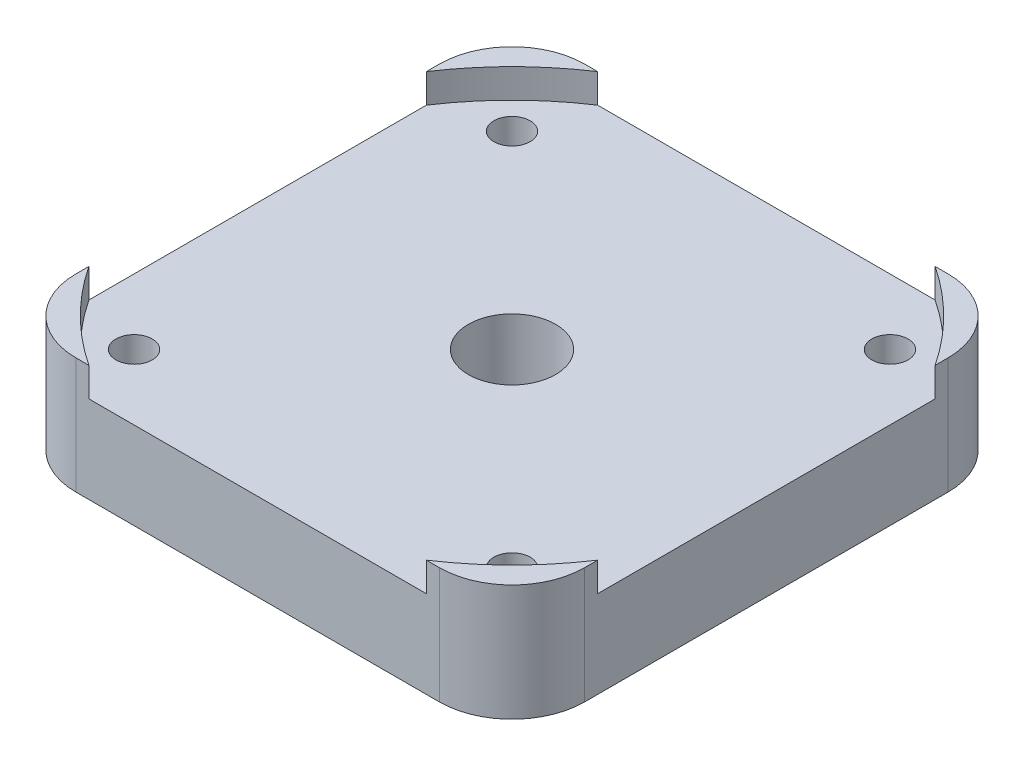
ISO-10303-21;
HEADER;
FILE_DESCRIPTION(('STEP AP214'),'2;1');
FILE_NAME('part.step','',(''),(''),'','','');
FILE_SCHEMA(('AUTOMOTIVE_DESIGN { 1 0 10303 214 1 1 1 1 }'));
ENDSEC;
DATA;
#1=APPLICATION_CONTEXT('core data for automotive mechanical design processes');
#2=APPLICATION_PROTOCOL_DEFINITION('international standard','automotive_design',2000,#1);
#3=PRODUCT_CONTEXT('',#1,'mechanical');
#4=PRODUCT('Part','Part','',(#3));
#5=PRODUCT_RELATED_PRODUCT_CATEGORY('part','',(#4));
#6=PRODUCT_DEFINITION_FORMATION('','',#4);
#7=PRODUCT_DEFINITION_CONTEXT('part definition',#1,'design');
#8=PRODUCT_DEFINITION('design','',#6,#7);
#9=PRODUCT_DEFINITION_SHAPE('','',#8);
#10=(LENGTH_UNIT() NAMED_UNIT(*) SI_UNIT(.MILLI.,.METRE.));
#11=(NAMED_UNIT(*) PLANE_ANGLE_UNIT() SI_UNIT($,.RADIAN.));
#12=(NAMED_UNIT(*) SI_UNIT($,.STERADIAN.) SOLID_ANGLE_UNIT());
#13=UNCERTAINTY_MEASURE_WITH_UNIT(LENGTH_MEASURE(1.E-05),#10,'distance_accuracy_value','');
#14=(GEOMETRIC_REPRESENTATION_CONTEXT(3) GLOBAL_UNCERTAINTY_ASSIGNED_CONTEXT((#13)) GLOBAL_UNIT_ASSIGNED_CONTEXT((#10,
#11,#12)) REPRESENTATION_CONTEXT('',''));
#15=CARTESIAN_POINT('',(0.,0.,0.));
#16=DIRECTION('',(0.,0.,1.));
#17=DIRECTION('',(1.,0.,0.));
#18=AXIS2_PLACEMENT_3D('',#15,#16,#17);
#19=CARTESIAN_POINT('',(0.,0.,0.));
#20=DIRECTION('',(0.,1.,0.));
#21=DIRECTION('',(1.,0.,0.));
#22=AXIS2_PLACEMENT_3D('',#19,#20,#21);
#23=PLANE('',#22);
#24=DIRECTION('',(-1.,0.,0.));
#25=VECTOR('',#24,1.);
#26=CARTESIAN_POINT('',(12.5,0.,-17.5));
#27=LINE('',#26,#25);
#28=CARTESIAN_POINT('',(12.5,0.,-17.5));
#29=VERTEX_POINT('',#28);
#30=CARTESIAN_POINT('',(-12.5,0.,-17.5));
#31=VERTEX_POINT('',#30);
#32=EDGE_CURVE('E35',#29,#31,#27,.T.);
#33=ORIENTED_EDGE('',*,*,#32,.F.);
#34=CARTESIAN_POINT('',(12.5,0.,-12.5));
#35=DIRECTION('',(0.,-1.,0.));
#36=DIRECTION('',(0.,0.,-1.));
#37=AXIS2_PLACEMENT_3D('',#34,#35,#36);
#38=CIRCLE('',#37,5.);
#39=CARTESIAN_POINT('',(17.5,0.,-12.5));
#40=VERTEX_POINT('',#39);
#41=EDGE_CURVE('E11',#29,#40,#38,.T.);
#42=ORIENTED_EDGE('',*,*,#41,.T.);
#43=DIRECTION('',(0.,0.,-1.));
#44=VECTOR('',#43,1.);
#45=CARTESIAN_POINT('',(17.5,0.,12.5));
#46=LINE('',#45,#44);
#47=CARTESIAN_POINT('',(17.5,0.,12.5));
#48=VERTEX_POINT('',#47);
#49=EDGE_CURVE('E271',#48,#40,#46,.T.);
#50=ORIENTED_EDGE('',*,*,#49,.F.);
#51=CARTESIAN_POINT('',(12.5,0.,12.5));
#52=DIRECTION('',(0.,-1.,0.));
#53=DIRECTION('',(1.,0.,0.));
#54=AXIS2_PLACEMENT_3D('',#51,#52,#53);
#55=CIRCLE('',#54,5.);
#56=CARTESIAN_POINT('',(12.5,0.,17.5));
#57=VERTEX_POINT('',#56);
#58=EDGE_CURVE('E27',#48,#57,#55,.T.);
#59=ORIENTED_EDGE('',*,*,#58,.T.);
#60=DIRECTION('',(1.,0.,0.));
#61=VECTOR('',#60,1.);
#62=CARTESIAN_POINT('',(-12.5,0.,17.5));
#63=LINE('',#62,#61);
#64=CARTESIAN_POINT('',(-12.5,0.,17.5));
#65=VERTEX_POINT('',#64);
#66=EDGE_CURVE('E150',#65,#57,#63,.T.);
#67=ORIENTED_EDGE('',*,*,#66,.F.);
#68=CARTESIAN_POINT('',(-12.5,0.,12.5));
#69=DIRECTION('',(0.,-1.,0.));
#70=DIRECTION('',(0.,0.,1.));
#71=AXIS2_PLACEMENT_3D('',#68,#69,#70);
#72=CIRCLE('',#71,5.);
#73=CARTESIAN_POINT('',(-17.5,0.,12.5));
#74=VERTEX_POINT('',#73);
#75=EDGE_CURVE('E148',#65,#74,#72,.T.);
#76=ORIENTED_EDGE('',*,*,#75,.T.);
#77=DIRECTION('',(0.,0.,1.));
#78=VECTOR('',#77,1.);
#79=CARTESIAN_POINT('',(-17.5,0.,-12.5));
#80=LINE('',#79,#78);
#81=CARTESIAN_POINT('',(-17.5,0.,-12.5));
#82=VERTEX_POINT('',#81);
#83=EDGE_CURVE('E219',#82,#74,#80,.T.);
#84=ORIENTED_EDGE('',*,*,#83,.F.);
#85=CARTESIAN_POINT('',(-12.5,0.,-12.5));
#86=DIRECTION('',(0.,-1.,0.));
#87=DIRECTION('',(-1.,0.,0.));
#88=AXIS2_PLACEMENT_3D('',#85,#86,#87);
#89=CIRCLE('',#88,5.);
#90=EDGE_CURVE('E283',#82,#31,#89,.T.);
#91=ORIENTED_EDGE('',*,*,#90,.T.);
#92=EDGE_LOOP('',(#33,#42,#50,#59,#67,#76,#84,#91));
#93=FACE_BOUND('',#92,.T.);
#94=CARTESIAN_POINT('',(0.,0.,0.));
#95=DIRECTION('',(0.,-1.,0.));
#96=DIRECTION('',(1.,0.,0.));
#97=AXIS2_PLACEMENT_3D('',#94,#95,#96);
#98=CIRCLE('',#97,11.);
#99=CARTESIAN_POINT('',(11.,0.,0.));
#100=VERTEX_POINT('',#99);
#101=EDGE_CURVE('E287',#100,#100,#98,.T.);
#102=ORIENTED_EDGE('',*,*,#101,.F.);
#103=EDGE_LOOP('',(#102));
#104=FACE_BOUND('',#103,.T.);
#105=CARTESIAN_POINT('',(-13.,0.,-13.));
#106=DIRECTION('',(0.,1.,0.));
#107=DIRECTION('',(1.,0.,0.));
#108=AXIS2_PLACEMENT_3D('',#105,#106,#107);
#109=CIRCLE('',#108,1.25);
#110=CARTESIAN_POINT('',(-11.75,0.,-13.));
#111=VERTEX_POINT('',#110);
#112=EDGE_CURVE('E286',#111,#111,#109,.T.);
#113=ORIENTED_EDGE('',*,*,#112,.T.);
#114=EDGE_LOOP('',(#113));
#115=FACE_BOUND('',#114,.T.);
#116=CARTESIAN_POINT('',(-13.,0.,13.));
#117=DIRECTION('',(0.,1.,0.));
#118=DIRECTION('',(0.,0.,-1.));
#119=AXIS2_PLACEMENT_3D('',#116,#117,#118);
#120=CIRCLE('',#119,1.25);
#121=CARTESIAN_POINT('',(-13.,0.,11.75));
#122=VERTEX_POINT('',#121);
#123=EDGE_CURVE('E294',#122,#122,#120,.T.);
#124=ORIENTED_EDGE('',*,*,#123,.T.);
#125=EDGE_LOOP('',(#124));
#126=FACE_BOUND('',#125,.T.);
#127=CARTESIAN_POINT('',(13.,0.,13.));
#128=DIRECTION('',(0.,1.,0.));
#129=DIRECTION('',(-1.,0.,0.));
#130=AXIS2_PLACEMENT_3D('',#127,#128,#129);
#131=CIRCLE('',#130,1.25);
#132=CARTESIAN_POINT('',(11.75,0.,13.));
#133=VERTEX_POINT('',#132);
#134=EDGE_CURVE('E297',#133,#133,#131,.T.);
#135=ORIENTED_EDGE('',*,*,#134,.T.);
#136=EDGE_LOOP('',(#135));
#137=FACE_BOUND('',#136,.T.);
#138=CARTESIAN_POINT('',(13.,0.,-13.));
#139=DIRECTION('',(0.,1.,0.));
#140=DIRECTION('',(0.,0.,1.));
#141=AXIS2_PLACEMENT_3D('',#138,#139,#140);
#142=CIRCLE('',#141,1.25);
#143=CARTESIAN_POINT('',(13.,0.,-11.75));
#144=VERTEX_POINT('',#143);
#145=EDGE_CURVE('E290',#144,#144,#142,.T.);
#146=ORIENTED_EDGE('',*,*,#145,.T.);
#147=EDGE_LOOP('',(#146));
#148=FACE_BOUND('',#147,.T.);
#149=ADVANCED_FACE('F17',(#93,#104,#115,#126,#137,#148),#23,.F.);
#150=CARTESIAN_POINT('',(0.,0.,0.));
#151=DIRECTION('',(0.,-1.,0.));
#152=DIRECTION('',(-1.,0.,0.));
#153=AXIS2_PLACEMENT_3D('',#150,#151,#152);
#154=CYLINDRICAL_SURFACE('',#153,11.);
#155=CARTESIAN_POINT('',(0.,-2.5,0.));
#156=DIRECTION('',(0.,-1.,0.));
#157=DIRECTION('',(-1.,0.,0.));
#158=AXIS2_PLACEMENT_3D('',#155,#156,#157);
#159=CIRCLE('',#158,11.);
#160=CARTESIAN_POINT('',(-11.,-2.5,0.));
#161=VERTEX_POINT('',#160);
#162=EDGE_CURVE('E291',#161,#161,#159,.T.);
#163=ORIENTED_EDGE('',*,*,#162,.F.);
#164=EDGE_LOOP('',(#163));
#165=FACE_BOUND('',#164,.T.);
#166=ORIENTED_EDGE('',*,*,#101,.T.);
#167=EDGE_LOOP('',(#166));
#168=FACE_BOUND('',#167,.T.);
#169=ADVANCED_FACE('F333',(#165,#168),#154,.T.);
#170=CARTESIAN_POINT('',(0.,-2.5,0.));
#171=DIRECTION('',(0.,-1.,0.));
#172=DIRECTION('',(-1.,0.,0.));
#173=AXIS2_PLACEMENT_3D('',#170,#171,#172);
#174=PLANE('',#173);
#175=ORIENTED_EDGE('',*,*,#162,.T.);
#176=EDGE_LOOP('',(#175));
#177=FACE_BOUND('',#176,.T.);
#178=CARTESIAN_POINT('',(0.,-2.5,0.));
#179=DIRECTION('',(0.,1.,0.));
#180=DIRECTION('',(1.,0.,0.));
#181=AXIS2_PLACEMENT_3D('',#178,#179,#180);
#182=CIRCLE('',#181,3.);
#183=CARTESIAN_POINT('',(3.,-2.5,0.));
#184=VERTEX_POINT('',#183);
#185=EDGE_CURVE('E303',#184,#184,#182,.T.);
#186=ORIENTED_EDGE('',*,*,#185,.T.);
#187=EDGE_LOOP('',(#186));
#188=FACE_BOUND('',#187,.T.);
#189=ADVANCED_FACE('F339',(#177,#188),#174,.T.);
#190=CARTESIAN_POINT('',(0.,-2.5,0.));
#191=DIRECTION('',(0.,1.,0.));
#192=DIRECTION('',(-1.,0.,0.));
#193=AXIS2_PLACEMENT_3D('',#190,#191,#192);
#194=CYLINDRICAL_SURFACE('',#193,3.);
#195=CARTESIAN_POINT('',(0.,6.,0.));
#196=DIRECTION('',(0.,1.,0.));
#197=DIRECTION('',(-1.,0.,0.));
#198=AXIS2_PLACEMENT_3D('',#195,#196,#197);
#199=CIRCLE('',#198,3.);
#200=CARTESIAN_POINT('',(-3.,6.,0.));
#201=VERTEX_POINT('',#200);
#202=EDGE_CURVE('E203',#201,#201,#199,.T.);
#203=ORIENTED_EDGE('',*,*,#202,.T.);
#204=EDGE_LOOP('',(#203));
#205=FACE_BOUND('',#204,.T.);
#206=ORIENTED_EDGE('',*,*,#185,.F.);
#207=EDGE_LOOP('',(#206));
#208=FACE_BOUND('',#207,.T.);
#209=ADVANCED_FACE('F310',(#205,#208),#194,.F.);
#210=CARTESIAN_POINT('',(0.,6.,0.));
#211=DIRECTION('',(0.,-1.,0.));
#212=DIRECTION('',(1.,0.,0.));
#213=AXIS2_PLACEMENT_3D('',#210,#211,#212);
#214=PLANE('',#213);
#215=CARTESIAN_POINT('',(0.,6.,0.));
#216=DIRECTION('',(0.,-1.,0.));
#217=DIRECTION('',(-0.552770798392605,0.,0.833333333333308));
#218=AXIS2_PLACEMENT_3D('',#215,#216,#217);
#219=CIRCLE('',#218,21.);
#220=CARTESIAN_POINT('',(-11.60818676624,6.,17.5));
#221=VERTEX_POINT('',#220);
#222=CARTESIAN_POINT('',(-17.5,6.,11.60818676624));
#223=VERTEX_POINT('',#222);
#224=EDGE_CURVE('E190',#221,#223,#219,.T.);
#225=ORIENTED_EDGE('',*,*,#224,.F.);
#226=DIRECTION('',(1.,0.,0.));
#227=VECTOR('',#226,1.);
#228=CARTESIAN_POINT('',(-11.60818676624,6.,17.5));
#229=LINE('',#228,#227);
#230=CARTESIAN_POINT('',(11.60818676624,6.,17.5));
#231=VERTEX_POINT('',#230);
#232=EDGE_CURVE('E205',#221,#231,#229,.T.);
#233=ORIENTED_EDGE('',*,*,#232,.T.);
#234=CARTESIAN_POINT('',(0.,6.,0.));
#235=DIRECTION('',(0.,-1.,0.));
#236=DIRECTION('',(0.833333333333308,0.,0.552770798392605));
#237=AXIS2_PLACEMENT_3D('',#234,#235,#236);
#238=CIRCLE('',#237,21.);
#239=CARTESIAN_POINT('',(17.5,6.,11.60818676624));
#240=VERTEX_POINT('',#239);
#241=EDGE_CURVE('E189',#240,#231,#238,.T.);
#242=ORIENTED_EDGE('',*,*,#241,.F.);
#243=DIRECTION('',(0.,0.,-1.));
#244=VECTOR('',#243,1.);
#245=CARTESIAN_POINT('',(17.5,6.,11.60818676624));
#246=LINE('',#245,#244);
#247=CARTESIAN_POINT('',(17.5,6.,-11.60818676624));
#248=VERTEX_POINT('',#247);
#249=EDGE_CURVE('E207',#240,#248,#246,.T.);
#250=ORIENTED_EDGE('',*,*,#249,.T.);
#251=CARTESIAN_POINT('',(0.,6.,0.));
#252=DIRECTION('',(0.,-1.,0.));
#253=DIRECTION('',(0.552770798392605,0.,-0.833333333333308));
#254=AXIS2_PLACEMENT_3D('',#251,#252,#253);
#255=CIRCLE('',#254,21.);
#256=CARTESIAN_POINT('',(11.60818676624,6.,-17.5));
#257=VERTEX_POINT('',#256);
#258=EDGE_CURVE('E212',#257,#248,#255,.T.);
#259=ORIENTED_EDGE('',*,*,#258,.F.);
#260=DIRECTION('',(-1.,0.,0.));
#261=VECTOR('',#260,1.);
#262=CARTESIAN_POINT('',(11.60818676624,6.,-17.5));
#263=LINE('',#262,#261);
#264=CARTESIAN_POINT('',(-11.60818676624,6.,-17.5));
#265=VERTEX_POINT('',#264);
#266=EDGE_CURVE('E211',#257,#265,#263,.T.);
#267=ORIENTED_EDGE('',*,*,#266,.T.);
#268=CARTESIAN_POINT('',(0.,6.,0.));
#269=DIRECTION('',(0.,-1.,0.));
#270=DIRECTION('',(-0.833333333333308,0.,-0.552770798392605));
#271=AXIS2_PLACEMENT_3D('',#268,#269,#270);
#272=CIRCLE('',#271,21.);
#273=CARTESIAN_POINT('',(-17.5,6.,-11.60818676624));
#274=VERTEX_POINT('',#273);
#275=EDGE_CURVE('E159',#274,#265,#272,.T.);
#276=ORIENTED_EDGE('',*,*,#275,.F.);
#277=DIRECTION('',(0.,0.,1.));
#278=VECTOR('',#277,1.);
#279=CARTESIAN_POINT('',(-17.5,6.,-11.60818676624));
#280=LINE('',#279,#278);
#281=EDGE_CURVE('E217',#274,#223,#280,.T.);
#282=ORIENTED_EDGE('',*,*,#281,.T.);
#283=EDGE_LOOP('',(#225,#233,#242,#250,#259,#267,#276,#282));
#284=FACE_BOUND('',#283,.T.);
#285=ORIENTED_EDGE('',*,*,#202,.F.);
#286=EDGE_LOOP('',(#285));
#287=FACE_BOUND('',#286,.T.);
#288=CARTESIAN_POINT('',(-13.,6.,-13.));
#289=DIRECTION('',(0.,1.,0.));
#290=DIRECTION('',(1.,0.,0.));
#291=AXIS2_PLACEMENT_3D('',#288,#289,#290);
#292=CIRCLE('',#291,1.25);
#293=CARTESIAN_POINT('',(-11.75,6.,-13.));
#294=VERTEX_POINT('',#293);
#295=EDGE_CURVE('E194',#294,#294,#292,.T.);
#296=ORIENTED_EDGE('',*,*,#295,.F.);
#297=EDGE_LOOP('',(#296));
#298=FACE_BOUND('',#297,.T.);
#299=CARTESIAN_POINT('',(-13.,6.,13.));
#300=DIRECTION('',(0.,1.,0.));
#301=DIRECTION('',(0.,0.,-1.));
#302=AXIS2_PLACEMENT_3D('',#299,#300,#301);
#303=CIRCLE('',#302,1.25);
#304=CARTESIAN_POINT('',(-13.,6.,11.75));
#305=VERTEX_POINT('',#304);
#306=EDGE_CURVE('E199',#305,#305,#303,.T.);
#307=ORIENTED_EDGE('',*,*,#306,.F.);
#308=EDGE_LOOP('',(#307));
#309=FACE_BOUND('',#308,.T.);
#310=CARTESIAN_POINT('',(13.,6.,13.));
#311=DIRECTION('',(0.,1.,0.));
#312=DIRECTION('',(-1.,0.,0.));
#313=AXIS2_PLACEMENT_3D('',#310,#311,#312);
#314=CIRCLE('',#313,1.25);
#315=CARTESIAN_POINT('',(11.75,6.,13.));
#316=VERTEX_POINT('',#315);
#317=EDGE_CURVE('E223',#316,#316,#314,.T.);
#318=ORIENTED_EDGE('',*,*,#317,.F.);
#319=EDGE_LOOP('',(#318));
#320=FACE_BOUND('',#319,.T.);
#321=CARTESIAN_POINT('',(13.,6.,-13.));
#322=DIRECTION('',(0.,1.,0.));
#323=DIRECTION('',(0.,0.,1.));
#324=AXIS2_PLACEMENT_3D('',#321,#322,#323);
#325=CIRCLE('',#324,1.25);
#326=CARTESIAN_POINT('',(13.,6.,-11.75));
#327=VERTEX_POINT('',#326);
#328=EDGE_CURVE('E226',#327,#327,#325,.T.);
#329=ORIENTED_EDGE('',*,*,#328,.F.);
#330=EDGE_LOOP('',(#329));
#331=FACE_BOUND('',#330,.T.);
#332=ADVANCED_FACE('F313',(#284,#287,#298,#309,#320,#331),#214,.F.);
#333=CARTESIAN_POINT('',(-17.5,0.,-17.5));
#334=DIRECTION('',(-1.,0.,0.));
#335=DIRECTION('',(0.,0.,1.));
#336=AXIS2_PLACEMENT_3D('',#333,#334,#335);
#337=PLANE('',#336);
#338=ORIENTED_EDGE('',*,*,#83,.T.);
#339=DIRECTION('',(0.,-1.,0.));
#340=VECTOR('',#339,1.);
#341=CARTESIAN_POINT('',(-17.5,8.,12.5));
#342=LINE('',#341,#340);
#343=CARTESIAN_POINT('',(-17.5,8.,12.5));
#344=VERTEX_POINT('',#343);
#345=EDGE_CURVE('E229',#344,#74,#342,.T.);
#346=ORIENTED_EDGE('',*,*,#345,.F.);
#347=DIRECTION('',(0.,0.,1.));
#348=VECTOR('',#347,1.);
#349=CARTESIAN_POINT('',(-17.5,8.,11.60818676624));
#350=LINE('',#349,#348);
#351=CARTESIAN_POINT('',(-17.5,8.,11.60818676624));
#352=VERTEX_POINT('',#351);
#353=EDGE_CURVE('E153',#352,#344,#350,.T.);
#354=ORIENTED_EDGE('',*,*,#353,.F.);
#355=DIRECTION('',(0.,-1.,0.));
#356=VECTOR('',#355,1.);
#357=CARTESIAN_POINT('',(-17.5,8.,11.60818676624));
#358=LINE('',#357,#356);
#359=EDGE_CURVE('E231',#352,#223,#358,.T.);
#360=ORIENTED_EDGE('',*,*,#359,.T.);
#361=ORIENTED_EDGE('',*,*,#281,.F.);
#362=DIRECTION('',(0.,-1.,0.));
#363=VECTOR('',#362,1.);
#364=CARTESIAN_POINT('',(-17.5,8.,-11.60818676624));
#365=LINE('',#364,#363);
#366=CARTESIAN_POINT('',(-17.5,8.,-11.60818676624));
#367=VERTEX_POINT('',#366);
#368=EDGE_CURVE('E155',#367,#274,#365,.T.);
#369=ORIENTED_EDGE('',*,*,#368,.F.);
#370=DIRECTION('',(0.,0.,1.));
#371=VECTOR('',#370,1.);
#372=CARTESIAN_POINT('',(-17.5,8.,-12.5));
#373=LINE('',#372,#371);
#374=CARTESIAN_POINT('',(-17.5,8.,-12.5));
#375=VERTEX_POINT('',#374);
#376=EDGE_CURVE('E165',#375,#367,#373,.T.);
#377=ORIENTED_EDGE('',*,*,#376,.F.);
#378=DIRECTION('',(0.,-1.,0.));
#379=VECTOR('',#378,1.);
#380=CARTESIAN_POINT('',(-17.5,8.,-12.5));
#381=LINE('',#380,#379);
#382=EDGE_CURVE('E233',#375,#82,#381,.T.);
#383=ORIENTED_EDGE('',*,*,#382,.T.);
#384=EDGE_LOOP('',(#338,#346,#354,#360,#361,#369,#377,#383));
#385=FACE_BOUND('',#384,.T.);
#386=ADVANCED_FACE('F316',(#385),#337,.T.);
#387=CARTESIAN_POINT('',(-12.5,21.6878,-12.5));
#388=DIRECTION('',(0.,-1.,0.));
#389=DIRECTION('',(-1.,0.,0.));
#390=AXIS2_PLACEMENT_3D('',#387,#388,#389);
#391=CYLINDRICAL_SURFACE('',#390,5.);
#392=ORIENTED_EDGE('',*,*,#382,.F.);
#393=CARTESIAN_POINT('',(-12.5,8.,-12.5));
#394=DIRECTION('',(0.,1.,0.));
#395=DIRECTION('',(0.,0.,-1.));
#396=AXIS2_PLACEMENT_3D('',#393,#394,#395);
#397=CIRCLE('',#396,5.);
#398=CARTESIAN_POINT('',(-12.5,8.,-17.5));
#399=VERTEX_POINT('',#398);
#400=EDGE_CURVE('E240',#399,#375,#397,.T.);
#401=ORIENTED_EDGE('',*,*,#400,.F.);
#402=DIRECTION('',(0.,-1.,0.));
#403=VECTOR('',#402,1.);
#404=CARTESIAN_POINT('',(-12.5,8.,-17.5));
#405=LINE('',#404,#403);
#406=EDGE_CURVE('E239',#399,#31,#405,.T.);
#407=ORIENTED_EDGE('',*,*,#406,.T.);
#408=ORIENTED_EDGE('',*,*,#90,.F.);
#409=EDGE_LOOP('',(#392,#401,#407,#408));
#410=FACE_BOUND('',#409,.T.);
#411=ADVANCED_FACE('F351',(#410),#391,.T.);
#412=CARTESIAN_POINT('',(17.5,0.,-17.5));
#413=DIRECTION('',(0.,0.,-1.));
#414=DIRECTION('',(-1.,0.,0.));
#415=AXIS2_PLACEMENT_3D('',#412,#413,#414);
#416=PLANE('',#415);
#417=DIRECTION('',(-1.,0.,0.));
#418=VECTOR('',#417,1.);
#419=CARTESIAN_POINT('',(-11.60818676624,8.,-17.5));
#420=LINE('',#419,#418);
#421=CARTESIAN_POINT('',(-11.60818676624,8.,-17.5));
#422=VERTEX_POINT('',#421);
#423=EDGE_CURVE('E166',#422,#399,#420,.T.);
#424=ORIENTED_EDGE('',*,*,#423,.F.);
#425=DIRECTION('',(0.,-1.,0.));
#426=VECTOR('',#425,1.);
#427=CARTESIAN_POINT('',(-11.60818676624,8.,-17.5));
#428=LINE('',#427,#426);
#429=EDGE_CURVE('E245',#422,#265,#428,.T.);
#430=ORIENTED_EDGE('',*,*,#429,.T.);
#431=ORIENTED_EDGE('',*,*,#266,.F.);
#432=DIRECTION('',(0.,-1.,0.));
#433=VECTOR('',#432,1.);
#434=CARTESIAN_POINT('',(11.60818676624,8.,-17.5));
#435=LINE('',#434,#433);
#436=CARTESIAN_POINT('',(11.60818676624,8.,-17.5));
#437=VERTEX_POINT('',#436);
#438=EDGE_CURVE('E214',#437,#257,#435,.T.);
#439=ORIENTED_EDGE('',*,*,#438,.F.);
#440=DIRECTION('',(-1.,0.,0.));
#441=VECTOR('',#440,1.);
#442=CARTESIAN_POINT('',(12.5,8.,-17.5));
#443=LINE('',#442,#441);
#444=CARTESIAN_POINT('',(12.5,8.,-17.5));
#445=VERTEX_POINT('',#444);
#446=EDGE_CURVE('E169',#445,#437,#443,.T.);
#447=ORIENTED_EDGE('',*,*,#446,.F.);
#448=DIRECTION('',(0.,-1.,0.));
#449=VECTOR('',#448,1.);
#450=CARTESIAN_POINT('',(12.5,8.,-17.5));
#451=LINE('',#450,#449);
#452=EDGE_CURVE('E250',#445,#29,#451,.T.);
#453=ORIENTED_EDGE('',*,*,#452,.T.);
#454=ORIENTED_EDGE('',*,*,#32,.T.);
#455=ORIENTED_EDGE('',*,*,#406,.F.);
#456=EDGE_LOOP('',(#424,#430,#431,#439,#447,#453,#454,#455));
#457=FACE_BOUND('',#456,.T.);
#458=ADVANCED_FACE('F355',(#457),#416,.T.);
#459=CARTESIAN_POINT('',(12.5,21.6878,-12.5));
#460=DIRECTION('',(0.,-1.,0.));
#461=DIRECTION('',(0.,0.,-1.));
#462=AXIS2_PLACEMENT_3D('',#459,#460,#461);
#463=CYLINDRICAL_SURFACE('',#462,5.);
#464=ORIENTED_EDGE('',*,*,#452,.F.);
#465=CARTESIAN_POINT('',(12.5,8.,-12.5));
#466=DIRECTION('',(0.,1.,0.));
#467=DIRECTION('',(1.,0.,0.));
#468=AXIS2_PLACEMENT_3D('',#465,#466,#467);
#469=CIRCLE('',#468,5.);
#470=CARTESIAN_POINT('',(17.5,8.,-12.5));
#471=VERTEX_POINT('',#470);
#472=EDGE_CURVE('E179',#471,#445,#469,.T.);
#473=ORIENTED_EDGE('',*,*,#472,.F.);
#474=DIRECTION('',(0.,-1.,0.));
#475=VECTOR('',#474,1.);
#476=CARTESIAN_POINT('',(17.5,8.,-12.5));
#477=LINE('',#476,#475);
#478=EDGE_CURVE('E259',#471,#40,#477,.T.);
#479=ORIENTED_EDGE('',*,*,#478,.T.);
#480=ORIENTED_EDGE('',*,*,#41,.F.);
#481=EDGE_LOOP('',(#464,#473,#479,#480));
#482=FACE_BOUND('',#481,.T.);
#483=ADVANCED_FACE('F359',(#482),#463,.T.);
#484=CARTESIAN_POINT('',(17.5,0.,17.5));
#485=DIRECTION('',(1.,0.,0.));
#486=DIRECTION('',(0.,0.,-1.));
#487=AXIS2_PLACEMENT_3D('',#484,#485,#486);
#488=PLANE('',#487);
#489=DIRECTION('',(0.,0.,-1.));
#490=VECTOR('',#489,1.);
#491=CARTESIAN_POINT('',(17.5,8.,-11.60818676624));
#492=LINE('',#491,#490);
#493=CARTESIAN_POINT('',(17.5,8.,-11.60818676624));
#494=VERTEX_POINT('',#493);
#495=EDGE_CURVE('E170',#494,#471,#492,.T.);
#496=ORIENTED_EDGE('',*,*,#495,.F.);
#497=DIRECTION('',(0.,-1.,0.));
#498=VECTOR('',#497,1.);
#499=CARTESIAN_POINT('',(17.5,8.,-11.60818676624));
#500=LINE('',#499,#498);
#501=EDGE_CURVE('E262',#494,#248,#500,.T.);
#502=ORIENTED_EDGE('',*,*,#501,.T.);
#503=ORIENTED_EDGE('',*,*,#249,.F.);
#504=DIRECTION('',(0.,-1.,0.));
#505=VECTOR('',#504,1.);
#506=CARTESIAN_POINT('',(17.5,8.,11.60818676624));
#507=LINE('',#506,#505);
#508=CARTESIAN_POINT('',(17.5,8.,11.60818676624));
#509=VERTEX_POINT('',#508);
#510=EDGE_CURVE('E192',#509,#240,#507,.T.);
#511=ORIENTED_EDGE('',*,*,#510,.F.);
#512=DIRECTION('',(0.,0.,-1.));
#513=VECTOR('',#512,1.);
#514=CARTESIAN_POINT('',(17.5,8.,12.5));
#515=LINE('',#514,#513);
#516=CARTESIAN_POINT('',(17.5,8.,12.5));
#517=VERTEX_POINT('',#516);
#518=EDGE_CURVE('E173',#517,#509,#515,.T.);
#519=ORIENTED_EDGE('',*,*,#518,.F.);
#520=DIRECTION('',(0.,-1.,0.));
#521=VECTOR('',#520,1.);
#522=CARTESIAN_POINT('',(17.5,8.,12.5));
#523=LINE('',#522,#521);
#524=EDGE_CURVE('E267',#517,#48,#523,.T.);
#525=ORIENTED_EDGE('',*,*,#524,.T.);
#526=ORIENTED_EDGE('',*,*,#49,.T.);
#527=ORIENTED_EDGE('',*,*,#478,.F.);
#528=EDGE_LOOP('',(#496,#502,#503,#511,#519,#525,#526,#527));
#529=FACE_BOUND('',#528,.T.);
#530=ADVANCED_FACE('F363',(#529),#488,.T.);
#531=CARTESIAN_POINT('',(12.5,21.6878,12.5));
#532=DIRECTION('',(0.,-1.,0.));
#533=DIRECTION('',(1.,0.,0.));
#534=AXIS2_PLACEMENT_3D('',#531,#532,#533);
#535=CYLINDRICAL_SURFACE('',#534,5.);
#536=ORIENTED_EDGE('',*,*,#524,.F.);
#537=CARTESIAN_POINT('',(12.5,8.,12.5));
#538=DIRECTION('',(0.,1.,0.));
#539=DIRECTION('',(0.,0.,1.));
#540=AXIS2_PLACEMENT_3D('',#537,#538,#539);
#541=CIRCLE('',#540,5.);
#542=CARTESIAN_POINT('',(12.5,8.,17.5));
#543=VERTEX_POINT('',#542);
#544=EDGE_CURVE('E139',#543,#517,#541,.T.);
#545=ORIENTED_EDGE('',*,*,#544,.F.);
#546=DIRECTION('',(0.,-1.,0.));
#547=VECTOR('',#546,1.);
#548=CARTESIAN_POINT('',(12.5,8.,17.5));
#549=LINE('',#548,#547);
#550=EDGE_CURVE('E186',#543,#57,#549,.T.);
#551=ORIENTED_EDGE('',*,*,#550,.T.);
#552=ORIENTED_EDGE('',*,*,#58,.F.);
#553=EDGE_LOOP('',(#536,#545,#551,#552));
#554=FACE_BOUND('',#553,.T.);
#555=ADVANCED_FACE('F367',(#554),#535,.T.);
#556=CARTESIAN_POINT('',(-17.5,0.,17.5));
#557=DIRECTION('',(0.,0.,1.));
#558=DIRECTION('',(1.,0.,0.));
#559=AXIS2_PLACEMENT_3D('',#556,#557,#558);
#560=PLANE('',#559);
#561=DIRECTION('',(1.,0.,0.));
#562=VECTOR('',#561,1.);
#563=CARTESIAN_POINT('',(11.60818676624,8.,17.5));
#564=LINE('',#563,#562);
#565=CARTESIAN_POINT('',(11.60818676624,8.,17.5));
#566=VERTEX_POINT('',#565);
#567=EDGE_CURVE('E174',#566,#543,#564,.T.);
#568=ORIENTED_EDGE('',*,*,#567,.F.);
#569=DIRECTION('',(0.,-1.,0.));
#570=VECTOR('',#569,1.);
#571=CARTESIAN_POINT('',(11.60818676624,8.,17.5));
#572=LINE('',#571,#570);
#573=EDGE_CURVE('E149',#566,#231,#572,.T.);
#574=ORIENTED_EDGE('',*,*,#573,.T.);
#575=ORIENTED_EDGE('',*,*,#232,.F.);
#576=DIRECTION('',(0.,-1.,0.));
#577=VECTOR('',#576,1.);
#578=CARTESIAN_POINT('',(-11.60818676624,8.,17.5));
#579=LINE('',#578,#577);
#580=CARTESIAN_POINT('',(-11.60818676624,8.,17.5));
#581=VERTEX_POINT('',#580);
#582=EDGE_CURVE('E128',#581,#221,#579,.T.);
#583=ORIENTED_EDGE('',*,*,#582,.F.);
#584=DIRECTION('',(1.,0.,0.));
#585=VECTOR('',#584,1.);
#586=CARTESIAN_POINT('',(-12.5,8.,17.5));
#587=LINE('',#586,#585);
#588=CARTESIAN_POINT('',(-12.5,8.,17.5));
#589=VERTEX_POINT('',#588);
#590=EDGE_CURVE('E131',#589,#581,#587,.T.);
#591=ORIENTED_EDGE('',*,*,#590,.F.);
#592=DIRECTION('',(0.,-1.,0.));
#593=VECTOR('',#592,1.);
#594=CARTESIAN_POINT('',(-12.5,8.,17.5));
#595=LINE('',#594,#593);
#596=EDGE_CURVE('E134',#589,#65,#595,.T.);
#597=ORIENTED_EDGE('',*,*,#596,.T.);
#598=ORIENTED_EDGE('',*,*,#66,.T.);
#599=ORIENTED_EDGE('',*,*,#550,.F.);
#600=EDGE_LOOP('',(#568,#574,#575,#583,#591,#597,#598,#599));
#601=FACE_BOUND('',#600,.T.);
#602=ADVANCED_FACE('F133',(#601),#560,.T.);
#603=CARTESIAN_POINT('',(-12.5,21.6878,12.5));
#604=DIRECTION('',(0.,-1.,0.));
#605=DIRECTION('',(0.,0.,1.));
#606=AXIS2_PLACEMENT_3D('',#603,#604,#605);
#607=CYLINDRICAL_SURFACE('',#606,5.);
#608=ORIENTED_EDGE('',*,*,#596,.F.);
#609=CARTESIAN_POINT('',(-12.5,8.,12.5));
#610=DIRECTION('',(0.,1.,0.));
#611=DIRECTION('',(-1.,0.,0.));
#612=AXIS2_PLACEMENT_3D('',#609,#610,#611);
#613=CIRCLE('',#612,5.);
#614=EDGE_CURVE('E146',#344,#589,#613,.T.);
#615=ORIENTED_EDGE('',*,*,#614,.F.);
#616=ORIENTED_EDGE('',*,*,#345,.T.);
#617=ORIENTED_EDGE('',*,*,#75,.F.);
#618=EDGE_LOOP('',(#608,#615,#616,#617));
#619=FACE_BOUND('',#618,.T.);
#620=ADVANCED_FACE('F144',(#619),#607,.T.);
#621=CARTESIAN_POINT('',(0.,8.,0.));
#622=DIRECTION('',(0.,1.,0.));
#623=DIRECTION('',(1.,0.,0.));
#624=AXIS2_PLACEMENT_3D('',#621,#622,#623);
#625=PLANE('',#624);
#626=ORIENTED_EDGE('',*,*,#376,.T.);
#627=CARTESIAN_POINT('',(0.,8.,0.));
#628=DIRECTION('',(0.,-1.,0.));
#629=DIRECTION('',(-0.833333333333308,0.,-0.552770798392605));
#630=AXIS2_PLACEMENT_3D('',#627,#628,#629);
#631=CIRCLE('',#630,21.);
#632=EDGE_CURVE('E162',#367,#422,#631,.T.);
#633=ORIENTED_EDGE('',*,*,#632,.T.);
#634=ORIENTED_EDGE('',*,*,#423,.T.);
#635=ORIENTED_EDGE('',*,*,#400,.T.);
#636=EDGE_LOOP('',(#626,#633,#634,#635));
#637=FACE_BOUND('',#636,.T.);
#638=ADVANCED_FACE('F375',(#637),#625,.T.);
#639=CARTESIAN_POINT('',(0.,8.,0.));
#640=DIRECTION('',(0.,1.,0.));
#641=DIRECTION('',(1.,0.,0.));
#642=AXIS2_PLACEMENT_3D('',#639,#640,#641);
#643=PLANE('',#642);
#644=ORIENTED_EDGE('',*,*,#446,.T.);
#645=CARTESIAN_POINT('',(0.,8.,0.));
#646=DIRECTION('',(0.,-1.,0.));
#647=DIRECTION('',(0.552770798392605,0.,-0.833333333333308));
#648=AXIS2_PLACEMENT_3D('',#645,#646,#647);
#649=CIRCLE('',#648,21.);
#650=EDGE_CURVE('E167',#437,#494,#649,.T.);
#651=ORIENTED_EDGE('',*,*,#650,.T.);
#652=ORIENTED_EDGE('',*,*,#495,.T.);
#653=ORIENTED_EDGE('',*,*,#472,.T.);
#654=EDGE_LOOP('',(#644,#651,#652,#653));
#655=FACE_BOUND('',#654,.T.);
#656=ADVANCED_FACE('F378',(#655),#643,.T.);
#657=CARTESIAN_POINT('',(0.,8.,0.));
#658=DIRECTION('',(0.,1.,0.));
#659=DIRECTION('',(1.,0.,0.));
#660=AXIS2_PLACEMENT_3D('',#657,#658,#659);
#661=PLANE('',#660);
#662=ORIENTED_EDGE('',*,*,#518,.T.);
#663=CARTESIAN_POINT('',(0.,8.,0.));
#664=DIRECTION('',(0.,-1.,0.));
#665=DIRECTION('',(0.833333333333308,0.,0.552770798392605));
#666=AXIS2_PLACEMENT_3D('',#663,#664,#665);
#667=CIRCLE('',#666,21.);
#668=EDGE_CURVE('E171',#509,#566,#667,.T.);
#669=ORIENTED_EDGE('',*,*,#668,.T.);
#670=ORIENTED_EDGE('',*,*,#567,.T.);
#671=ORIENTED_EDGE('',*,*,#544,.T.);
#672=EDGE_LOOP('',(#662,#669,#670,#671));
#673=FACE_BOUND('',#672,.T.);
#674=ADVANCED_FACE('F382',(#673),#661,.T.);
#675=CARTESIAN_POINT('',(0.,8.,0.));
#676=DIRECTION('',(0.,1.,0.));
#677=DIRECTION('',(1.,0.,0.));
#678=AXIS2_PLACEMENT_3D('',#675,#676,#677);
#679=PLANE('',#678);
#680=ORIENTED_EDGE('',*,*,#590,.T.);
#681=CARTESIAN_POINT('',(0.,8.,0.));
#682=DIRECTION('',(0.,-1.,0.));
#683=DIRECTION('',(-0.552770798392605,0.,0.833333333333308));
#684=AXIS2_PLACEMENT_3D('',#681,#682,#683);
#685=CIRCLE('',#684,21.);
#686=EDGE_CURVE('E21',#581,#352,#685,.T.);
#687=ORIENTED_EDGE('',*,*,#686,.T.);
#688=ORIENTED_EDGE('',*,*,#353,.T.);
#689=ORIENTED_EDGE('',*,*,#614,.T.);
#690=EDGE_LOOP('',(#680,#687,#688,#689));
#691=FACE_BOUND('',#690,.T.);
#692=ADVANCED_FACE('F152',(#691),#679,.T.);
#693=CARTESIAN_POINT('',(0.,8.,0.));
#694=DIRECTION('',(0.,-1.,0.));
#695=DIRECTION('',(1.,0.,0.));
#696=AXIS2_PLACEMENT_3D('',#693,#694,#695);
#697=CYLINDRICAL_SURFACE('',#696,21.);
#698=ORIENTED_EDGE('',*,*,#368,.T.);
#699=ORIENTED_EDGE('',*,*,#275,.T.);
#700=ORIENTED_EDGE('',*,*,#429,.F.);
#701=ORIENTED_EDGE('',*,*,#632,.F.);
#702=EDGE_LOOP('',(#698,#699,#700,#701));
#703=FACE_BOUND('',#702,.T.);
#704=ADVANCED_FACE('F388',(#703),#697,.F.);
#705=CARTESIAN_POINT('',(0.,8.,0.));
#706=DIRECTION('',(0.,-1.,0.));
#707=DIRECTION('',(1.,0.,0.));
#708=AXIS2_PLACEMENT_3D('',#705,#706,#707);
#709=CYLINDRICAL_SURFACE('',#708,21.);
#710=ORIENTED_EDGE('',*,*,#438,.T.);
#711=ORIENTED_EDGE('',*,*,#258,.T.);
#712=ORIENTED_EDGE('',*,*,#501,.F.);
#713=ORIENTED_EDGE('',*,*,#650,.F.);
#714=EDGE_LOOP('',(#710,#711,#712,#713));
#715=FACE_BOUND('',#714,.T.);
#716=ADVANCED_FACE('F391',(#715),#709,.F.);
#717=CARTESIAN_POINT('',(0.,8.,0.));
#718=DIRECTION('',(0.,-1.,0.));
#719=DIRECTION('',(1.,0.,0.));
#720=AXIS2_PLACEMENT_3D('',#717,#718,#719);
#721=CYLINDRICAL_SURFACE('',#720,21.);
#722=ORIENTED_EDGE('',*,*,#510,.T.);
#723=ORIENTED_EDGE('',*,*,#241,.T.);
#724=ORIENTED_EDGE('',*,*,#573,.F.);
#725=ORIENTED_EDGE('',*,*,#668,.F.);
#726=EDGE_LOOP('',(#722,#723,#724,#725));
#727=FACE_BOUND('',#726,.T.);
#728=ADVANCED_FACE('F395',(#727),#721,.F.);
#729=CARTESIAN_POINT('',(0.,8.,0.));
#730=DIRECTION('',(0.,-1.,0.));
#731=DIRECTION('',(1.,0.,0.));
#732=AXIS2_PLACEMENT_3D('',#729,#730,#731);
#733=CYLINDRICAL_SURFACE('',#732,21.);
#734=ORIENTED_EDGE('',*,*,#582,.T.);
#735=ORIENTED_EDGE('',*,*,#224,.T.);
#736=ORIENTED_EDGE('',*,*,#359,.F.);
#737=ORIENTED_EDGE('',*,*,#686,.F.);
#738=EDGE_LOOP('',(#734,#735,#736,#737));
#739=FACE_BOUND('',#738,.T.);
#740=ADVANCED_FACE('F399',(#739),#733,.F.);
#741=CARTESIAN_POINT('',(-13.,0.,-13.));
#742=DIRECTION('',(0.,1.,0.));
#743=DIRECTION('',(-1.,0.,0.));
#744=AXIS2_PLACEMENT_3D('',#741,#742,#743);
#745=CYLINDRICAL_SURFACE('',#744,1.25);
#746=ORIENTED_EDGE('',*,*,#295,.T.);
#747=EDGE_LOOP('',(#746));
#748=FACE_BOUND('',#747,.T.);
#749=ORIENTED_EDGE('',*,*,#112,.F.);
#750=EDGE_LOOP('',(#749));
#751=FACE_BOUND('',#750,.T.);
#752=ADVANCED_FACE('F403',(#748,#751),#745,.F.);
#753=CARTESIAN_POINT('',(-13.,0.,13.));
#754=DIRECTION('',(0.,1.,0.));
#755=DIRECTION('',(0.,0.,1.));
#756=AXIS2_PLACEMENT_3D('',#753,#754,#755);
#757=CYLINDRICAL_SURFACE('',#756,1.25);
#758=ORIENTED_EDGE('',*,*,#306,.T.);
#759=EDGE_LOOP('',(#758));
#760=FACE_BOUND('',#759,.T.);
#761=ORIENTED_EDGE('',*,*,#123,.F.);
#762=EDGE_LOOP('',(#761));
#763=FACE_BOUND('',#762,.T.);
#764=ADVANCED_FACE('F406',(#760,#763),#757,.F.);
#765=CARTESIAN_POINT('',(13.,0.,13.));
#766=DIRECTION('',(0.,1.,0.));
#767=DIRECTION('',(1.,0.,0.));
#768=AXIS2_PLACEMENT_3D('',#765,#766,#767);
#769=CYLINDRICAL_SURFACE('',#768,1.25);
#770=ORIENTED_EDGE('',*,*,#317,.T.);
#771=EDGE_LOOP('',(#770));
#772=FACE_BOUND('',#771,.T.);
#773=ORIENTED_EDGE('',*,*,#134,.F.);
#774=EDGE_LOOP('',(#773));
#775=FACE_BOUND('',#774,.T.);
#776=ADVANCED_FACE('F329',(#772,#775),#769,.F.);
#777=CARTESIAN_POINT('',(13.,0.,-13.));
#778=DIRECTION('',(0.,1.,0.));
#779=DIRECTION('',(0.,0.,-1.));
#780=AXIS2_PLACEMENT_3D('',#777,#778,#779);
#781=CYLINDRICAL_SURFACE('',#780,1.25);
#782=ORIENTED_EDGE('',*,*,#328,.T.);
#783=EDGE_LOOP('',(#782));
#784=FACE_BOUND('',#783,.T.);
#785=ORIENTED_EDGE('',*,*,#145,.F.);
#786=EDGE_LOOP('',(#785));
#787=FACE_BOUND('',#786,.T.);
#788=ADVANCED_FACE('F19',(#784,#787),#781,.F.);
#789=CLOSED_SHELL('',(#149,#169,#189,#209,#332,#386,#411,#458,#483,#530,#555,#602,#620,#638,
#656,#674,#692,#704,#716,#728,#740,#752,#764,#776,#788));
#790=MANIFOLD_SOLID_BREP('B1',#789);
#791=ADVANCED_BREP_SHAPE_REPRESENTATION('',(#18,#790),#14);
#792=SHAPE_DEFINITION_REPRESENTATION(#9,#791);
ENDSEC;
END-ISO-10303-21;
